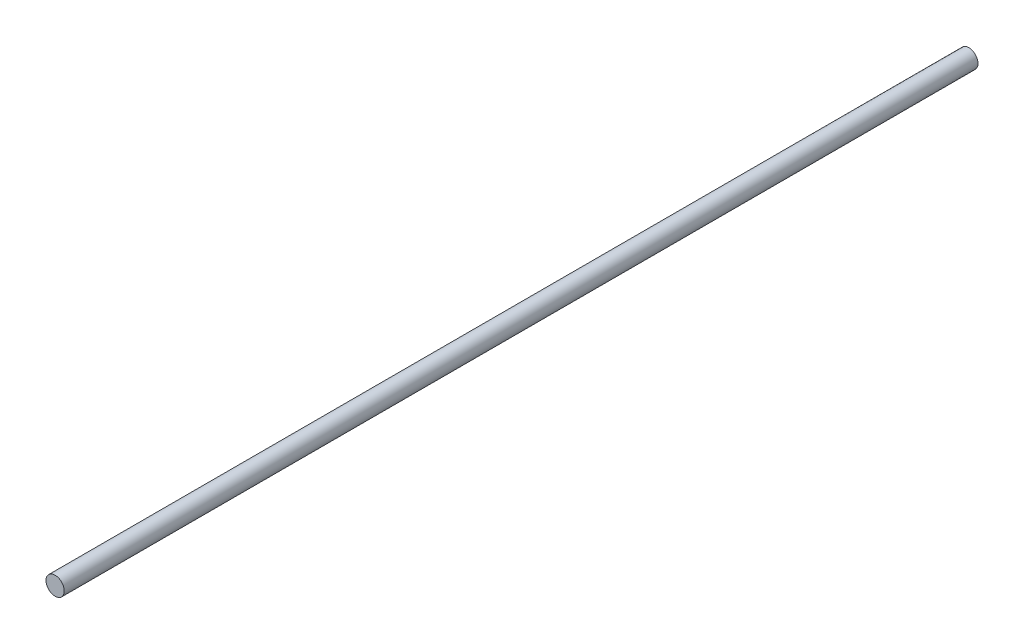
ISO-10303-21;
HEADER;
FILE_DESCRIPTION(('STEP AP214'),'2;1');
FILE_NAME('part.step','',(''),(''),'','','');
FILE_SCHEMA(('AUTOMOTIVE_DESIGN { 1 0 10303 214 1 1 1 1 }'));
ENDSEC;
DATA;
#1=APPLICATION_CONTEXT('core data for automotive mechanical design processes');
#2=APPLICATION_PROTOCOL_DEFINITION('international standard','automotive_design',2000,#1);
#3=PRODUCT_CONTEXT('',#1,'mechanical');
#4=PRODUCT('Part','Part','',(#3));
#5=PRODUCT_RELATED_PRODUCT_CATEGORY('part','',(#4));
#6=PRODUCT_DEFINITION_FORMATION('','',#4);
#7=PRODUCT_DEFINITION_CONTEXT('part definition',#1,'design');
#8=PRODUCT_DEFINITION('design','',#6,#7);
#9=PRODUCT_DEFINITION_SHAPE('','',#8);
#10=(LENGTH_UNIT() NAMED_UNIT(*) SI_UNIT(.MILLI.,.METRE.));
#11=(NAMED_UNIT(*) PLANE_ANGLE_UNIT() SI_UNIT($,.RADIAN.));
#12=(NAMED_UNIT(*) SI_UNIT($,.STERADIAN.) SOLID_ANGLE_UNIT());
#13=UNCERTAINTY_MEASURE_WITH_UNIT(LENGTH_MEASURE(1.E-05),#10,'distance_accuracy_value','');
#14=(GEOMETRIC_REPRESENTATION_CONTEXT(3) GLOBAL_UNCERTAINTY_ASSIGNED_CONTEXT((#13)) GLOBAL_UNIT_ASSIGNED_CONTEXT((#10,
#11,#12)) REPRESENTATION_CONTEXT('',''));
#15=CARTESIAN_POINT('',(0.,0.,0.));
#16=DIRECTION('',(0.,0.,1.));
#17=DIRECTION('',(1.,0.,0.));
#18=AXIS2_PLACEMENT_3D('',#15,#16,#17);
#19=CARTESIAN_POINT('',(0.,0.,50.));
#20=DIRECTION('',(0.,0.,-1.));
#21=DIRECTION('',(-1.,0.,0.));
#22=AXIS2_PLACEMENT_3D('',#19,#20,#21);
#23=CYLINDRICAL_SURFACE('',#22,1.);
#24=CARTESIAN_POINT('',(0.,0.,50.));
#25=DIRECTION('',(0.,0.,1.));
#26=DIRECTION('',(1.,0.,0.));
#27=AXIS2_PLACEMENT_3D('',#24,#25,#26);
#28=CIRCLE('',#27,1.);
#29=CARTESIAN_POINT('',(1.,0.,50.));
#30=VERTEX_POINT('',#29);
#31=EDGE_CURVE('E10',#30,#30,#28,.T.);
#32=ORIENTED_EDGE('',*,*,#31,.F.);
#33=EDGE_LOOP('',(#32));
#34=FACE_BOUND('',#33,.T.);
#35=CARTESIAN_POINT('',(0.,0.,-50.));
#36=DIRECTION('',(0.,0.,1.));
#37=DIRECTION('',(1.,0.,0.));
#38=AXIS2_PLACEMENT_3D('',#35,#36,#37);
#39=CIRCLE('',#38,1.);
#40=CARTESIAN_POINT('',(1.,0.,-50.));
#41=VERTEX_POINT('',#40);
#42=EDGE_CURVE('E40',#41,#41,#39,.T.);
#43=ORIENTED_EDGE('',*,*,#42,.T.);
#44=EDGE_LOOP('',(#43));
#45=FACE_BOUND('',#44,.T.);
#46=ADVANCED_FACE('F37',(#34,#45),#23,.T.);
#47=CARTESIAN_POINT('',(0.,0.,50.));
#48=DIRECTION('',(0.,0.,1.));
#49=DIRECTION('',(1.,0.,0.));
#50=AXIS2_PLACEMENT_3D('',#47,#48,#49);
#51=PLANE('',#50);
#52=ORIENTED_EDGE('',*,*,#31,.T.);
#53=EDGE_LOOP('',(#52));
#54=FACE_BOUND('',#53,.T.);
#55=ADVANCED_FACE('F54',(#54),#51,.T.);
#56=CARTESIAN_POINT('',(0.,0.,-50.));
#57=DIRECTION('',(0.,0.,1.));
#58=DIRECTION('',(1.,0.,0.));
#59=AXIS2_PLACEMENT_3D('',#56,#57,#58);
#60=PLANE('',#59);
#61=ORIENTED_EDGE('',*,*,#42,.F.);
#62=EDGE_LOOP('',(#61));
#63=FACE_BOUND('',#62,.T.);
#64=ADVANCED_FACE('F52',(#63),#60,.F.);
#65=CLOSED_SHELL('',(#46,#55,#64));
#66=MANIFOLD_SOLID_BREP('B2',#65);
#67=ADVANCED_BREP_SHAPE_REPRESENTATION('',(#18,#66),#14);
#68=SHAPE_DEFINITION_REPRESENTATION(#9,#67);
ENDSEC;
END-ISO-10303-21;
